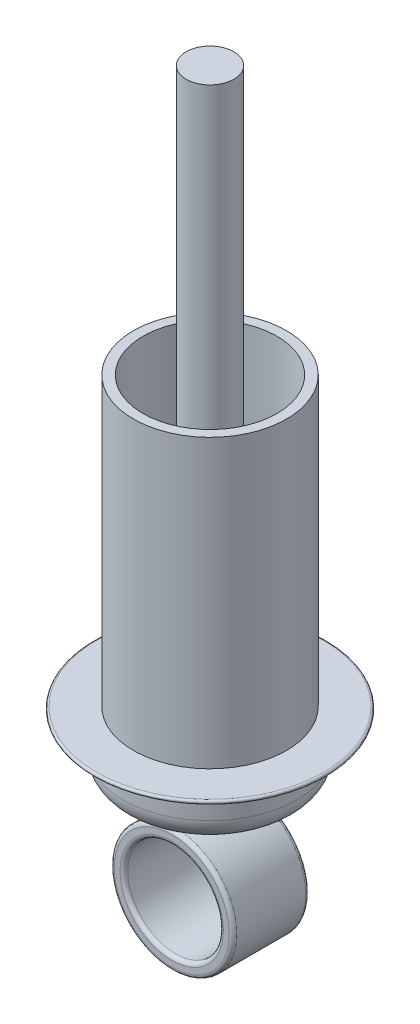
ISO-10303-21;
HEADER;
FILE_DESCRIPTION(('STEP AP214'),'2;1');
FILE_NAME('part.step','',(''),(''),'','','');
FILE_SCHEMA(('AUTOMOTIVE_DESIGN { 1 0 10303 214 1 1 1 1 }'));
ENDSEC;
DATA;
#1=APPLICATION_CONTEXT('core data for automotive mechanical design processes');
#2=APPLICATION_PROTOCOL_DEFINITION('international standard','automotive_design',2000,#1);
#3=PRODUCT_CONTEXT('',#1,'mechanical');
#4=PRODUCT('Part','Part','',(#3));
#5=PRODUCT_RELATED_PRODUCT_CATEGORY('part','',(#4));
#6=PRODUCT_DEFINITION_FORMATION('','',#4);
#7=PRODUCT_DEFINITION_CONTEXT('part definition',#1,'design');
#8=PRODUCT_DEFINITION('design','',#6,#7);
#9=PRODUCT_DEFINITION_SHAPE('','',#8);
#10=(LENGTH_UNIT() NAMED_UNIT(*) SI_UNIT(.MILLI.,.METRE.));
#11=(NAMED_UNIT(*) PLANE_ANGLE_UNIT() SI_UNIT($,.RADIAN.));
#12=(NAMED_UNIT(*) SI_UNIT($,.STERADIAN.) SOLID_ANGLE_UNIT());
#13=UNCERTAINTY_MEASURE_WITH_UNIT(LENGTH_MEASURE(1.E-05),#10,'distance_accuracy_value','');
#14=(GEOMETRIC_REPRESENTATION_CONTEXT(3) GLOBAL_UNCERTAINTY_ASSIGNED_CONTEXT((#13)) GLOBAL_UNIT_ASSIGNED_CONTEXT((#10,
#11,#12)) REPRESENTATION_CONTEXT('',''));
#15=CARTESIAN_POINT('',(0.,0.,0.));
#16=DIRECTION('',(0.,0.,1.));
#17=DIRECTION('',(1.,0.,0.));
#18=AXIS2_PLACEMENT_3D('',#15,#16,#17);
#19=CARTESIAN_POINT('',(0.,33.58905173027,0.));
#20=DIRECTION('',(0.,1.,0.));
#21=DIRECTION('',(0.,0.,-1.));
#22=AXIS2_PLACEMENT_3D('',#19,#20,#21);
#23=CYLINDRICAL_SURFACE('',#22,22.7249978923122);
#24=CARTESIAN_POINT('',(0.,38.,0.));
#25=DIRECTION('',(0.,1.,0.));
#26=DIRECTION('',(1.,0.,0.));
#27=AXIS2_PLACEMENT_3D('',#24,#25,#26);
#28=CIRCLE('',#27,22.7249978923122);
#29=CARTESIAN_POINT('',(0.,38.,22.7249978923122));
#30=VERTEX_POINT('',#29);
#31=EDGE_CURVE('P0_E199',#30,#30,#28,.T.);
#32=ORIENTED_EDGE('',*,*,#31,.F.);
#33=DIRECTION('',(0.,-1.,0.));
#34=VECTOR('',#33,1.);
#35=CARTESIAN_POINT('',(0.,33.58905173027,22.7249978923122));
#36=LINE('',#35,#34);
#37=CARTESIAN_POINT('',(0.,29.1781034605399,22.7249978923122));
#38=VERTEX_POINT('',#37);
#39=EDGE_CURVE('P0_E11',#30,#38,#36,.T.);
#40=ORIENTED_EDGE('',*,*,#39,.T.);
#41=CARTESIAN_POINT('',(0.,29.1781034605399,0.));
#42=DIRECTION('',(0.,1.,0.));
#43=DIRECTION('',(1.,0.,0.));
#44=AXIS2_PLACEMENT_3D('',#41,#42,#43);
#45=CIRCLE('',#44,22.7249978923122);
#46=CARTESIAN_POINT('',(0.,29.1781034605399,-22.7249978923122));
#47=VERTEX_POINT('',#46);
#48=EDGE_CURVE('P0_E122',#38,#47,#45,.T.);
#49=ORIENTED_EDGE('',*,*,#48,.T.);
#50=CARTESIAN_POINT('',(0.,29.1781034605399,0.));
#51=DIRECTION('',(0.,1.,0.));
#52=DIRECTION('',(1.,0.,0.));
#53=AXIS2_PLACEMENT_3D('',#50,#51,#52);
#54=CIRCLE('',#53,22.7249978923122);
#55=EDGE_CURVE('P0_E152',#47,#38,#54,.T.);
#56=ORIENTED_EDGE('',*,*,#55,.T.);
#57=ORIENTED_EDGE('',*,*,#39,.F.);
#58=EDGE_LOOP('',(#32,#40,#49,#56,#57));
#59=FACE_BOUND('',#58,.T.);
#60=ADVANCED_FACE('P0_F17',(#59),#23,.T.);
#61=CARTESIAN_POINT('',(0.,29.1781034605399,0.));
#62=DIRECTION('',(0.,1.,0.));
#63=DIRECTION('',(0.,0.,1.));
#64=AXIS2_PLACEMENT_3D('',#61,#62,#63);
#65=TOROIDAL_SURFACE('',#64,16.7249978923122,6.);
#66=ORIENTED_EDGE('',*,*,#48,.F.);
#67=ORIENTED_EDGE('',*,*,#55,.F.);
#68=CARTESIAN_POINT('',(0.,29.1781034605399,-16.7249978923122));
#69=DIRECTION('',(-1.,0.,0.));
#70=DIRECTION('',(0.,0.,-1.));
#71=AXIS2_PLACEMENT_3D('',#68,#69,#70);
#72=CIRCLE('',#71,6.);
#73=CARTESIAN_POINT('',(0.,24.2145079385144,-20.0958612081006));
#74=VERTEX_POINT('',#73);
#75=EDGE_CURVE('P0_E27',#47,#74,#72,.T.);
#76=ORIENTED_EDGE('',*,*,#75,.T.);
#77=CARTESIAN_POINT('',(0.,24.2145079385144,0.));
#78=DIRECTION('',(0.,1.,0.));
#79=DIRECTION('',(1.,0.,0.));
#80=AXIS2_PLACEMENT_3D('',#77,#78,#79);
#81=CIRCLE('',#80,20.0958612081006);
#82=CARTESIAN_POINT('',(0.,24.2145079385144,20.0958612081006));
#83=VERTEX_POINT('',#82);
#84=EDGE_CURVE('P0_E163',#74,#83,#81,.T.);
#85=ORIENTED_EDGE('',*,*,#84,.T.);
#86=CARTESIAN_POINT('',(0.,24.2145079385144,0.));
#87=DIRECTION('',(0.,1.,0.));
#88=DIRECTION('',(1.,0.,0.));
#89=AXIS2_PLACEMENT_3D('',#86,#87,#88);
#90=CIRCLE('',#89,20.0958612081006);
#91=EDGE_CURVE('P0_E120',#83,#74,#90,.T.);
#92=ORIENTED_EDGE('',*,*,#91,.T.);
#93=ORIENTED_EDGE('',*,*,#75,.F.);
#94=EDGE_LOOP('',(#66,#67,#76,#85,#92,#93));
#95=FACE_BOUND('',#94,.T.);
#96=ADVANCED_FACE('P0_F229',(#95),#65,.T.);
#97=CARTESIAN_POINT('',(0.,20.2799880489196,0.));
#98=DIRECTION('',(0.,1.,0.));
#99=DIRECTION('',(0.,0.,-1.));
#100=AXIS2_PLACEMENT_3D('',#97,#98,#99);
#101=CONICAL_SURFACE('',#100,14.3022814999462,0.974223551000245);
#102=ORIENTED_EDGE('',*,*,#84,.F.);
#103=ORIENTED_EDGE('',*,*,#91,.F.);
#104=DIRECTION('',(0.,-0.56181055263139,-0.827265920337597));
#105=VECTOR('',#104,1.);
#106=CARTESIAN_POINT('',(0.,20.2799880489196,14.3022814999462));
#107=LINE('',#106,#105);
#108=CARTESIAN_POINT('',(0.,16.3454681593248,8.50870179179187));
#109=VERTEX_POINT('',#108);
#110=EDGE_CURVE('P0_E61',#83,#109,#107,.T.);
#111=ORIENTED_EDGE('',*,*,#110,.T.);
#112=CARTESIAN_POINT('',(0.,16.3454681593248,0.));
#113=DIRECTION('',(0.,1.,0.));
#114=DIRECTION('',(1.,0.,0.));
#115=AXIS2_PLACEMENT_3D('',#112,#113,#114);
#116=CIRCLE('',#115,8.50870179179188);
#117=CARTESIAN_POINT('',(0.,16.3454681593248,-8.50870179179188));
#118=VERTEX_POINT('',#117);
#119=EDGE_CURVE('P0_E119',#109,#118,#116,.T.);
#120=ORIENTED_EDGE('',*,*,#119,.T.);
#121=CARTESIAN_POINT('',(0.,16.3454681593248,0.));
#122=DIRECTION('',(0.,1.,0.));
#123=DIRECTION('',(1.,0.,0.));
#124=AXIS2_PLACEMENT_3D('',#121,#122,#123);
#125=CIRCLE('',#124,8.50870179179188);
#126=EDGE_CURVE('P0_E125',#118,#109,#125,.T.);
#127=ORIENTED_EDGE('',*,*,#126,.T.);
#128=ORIENTED_EDGE('',*,*,#110,.F.);
#129=EDGE_LOOP('',(#102,#103,#111,#120,#127,#128));
#130=FACE_BOUND('',#129,.T.);
#131=ADVANCED_FACE('P0_F117',(#130),#101,.T.);
#132=CARTESIAN_POINT('',(0.,18.,0.));
#133=DIRECTION('',(0.,1.,0.));
#134=DIRECTION('',(0.,0.,1.));
#135=AXIS2_PLACEMENT_3D('',#132,#133,#134);
#136=TOROIDAL_SURFACE('',#135,7.3850806865291,2.);
#137=ORIENTED_EDGE('',*,*,#119,.F.);
#138=ORIENTED_EDGE('',*,*,#126,.F.);
#139=CARTESIAN_POINT('',(0.,18.,-7.3850806865291));
#140=DIRECTION('',(-1.,0.,0.));
#141=DIRECTION('',(0.,0.,-1.));
#142=AXIS2_PLACEMENT_3D('',#139,#140,#141);
#143=CIRCLE('',#142,2.);
#144=CARTESIAN_POINT('',(0.,16.,-7.38508068652909));
#145=VERTEX_POINT('',#144);
#146=EDGE_CURVE('P0_E128',#118,#145,#143,.T.);
#147=ORIENTED_EDGE('',*,*,#146,.T.);
#148=CARTESIAN_POINT('',(0.,16.,0.));
#149=DIRECTION('',(0.,1.,0.));
#150=DIRECTION('',(1.,0.,0.));
#151=AXIS2_PLACEMENT_3D('',#148,#149,#150);
#152=CIRCLE('',#151,7.38508068652909);
#153=CARTESIAN_POINT('',(0.,16.,7.38508068652909));
#154=VERTEX_POINT('',#153);
#155=EDGE_CURVE('P0_E133',#145,#154,#152,.T.);
#156=ORIENTED_EDGE('',*,*,#155,.T.);
#157=CARTESIAN_POINT('',(0.,16.,0.));
#158=DIRECTION('',(0.,1.,0.));
#159=DIRECTION('',(1.,0.,0.));
#160=AXIS2_PLACEMENT_3D('',#157,#158,#159);
#161=CIRCLE('',#160,7.38508068652909);
#162=EDGE_CURVE('P0_E145',#154,#145,#161,.T.);
#163=ORIENTED_EDGE('',*,*,#162,.T.);
#164=ORIENTED_EDGE('',*,*,#146,.F.);
#165=EDGE_LOOP('',(#137,#138,#147,#156,#163,#164));
#166=FACE_BOUND('',#165,.T.);
#167=ADVANCED_FACE('P0_F130',(#166),#136,.T.);
#168=CARTESIAN_POINT('',(0.,16.,-7.38508068652909));
#169=DIRECTION('',(0.,-1.,0.));
#170=DIRECTION('',(0.,0.,-1.));
#171=AXIS2_PLACEMENT_3D('',#168,#169,#170);
#172=PLANE('',#171);
#173=DIRECTION('',(0.,0.,1.));
#174=VECTOR('',#173,1.);
#175=CARTESIAN_POINT('',(0.,16.,0.));
#176=LINE('',#175,#174);
#177=EDGE_CURVE('P0_E147',#145,#154,#176,.T.);
#178=ORIENTED_EDGE('',*,*,#177,.T.);
#179=ORIENTED_EDGE('',*,*,#155,.F.);
#180=EDGE_LOOP('',(#178,#179));
#181=FACE_BOUND('',#180,.T.);
#182=ADVANCED_FACE('P0_F293',(#181),#172,.T.);
#183=CARTESIAN_POINT('',(0.,184.,0.));
#184=DIRECTION('',(0.,1.,0.));
#185=DIRECTION('',(1.,0.,0.));
#186=AXIS2_PLACEMENT_3D('',#183,#184,#185);
#187=PLANE('',#186);
#188=CARTESIAN_POINT('',(0.,184.,0.));
#189=DIRECTION('',(0.,1.,0.));
#190=DIRECTION('',(1.,0.,0.));
#191=AXIS2_PLACEMENT_3D('',#188,#189,#190);
#192=CIRCLE('',#191,6.23);
#193=CARTESIAN_POINT('',(0.,184.,6.23));
#194=VERTEX_POINT('',#193);
#195=EDGE_CURVE('P0_E172',#194,#194,#192,.T.);
#196=ORIENTED_EDGE('',*,*,#195,.T.);
#197=EDGE_LOOP('',(#196));
#198=FACE_BOUND('',#197,.T.);
#199=ADVANCED_FACE('P0_F297',(#198),#187,.T.);
#200=CARTESIAN_POINT('',(0.,111.5,0.));
#201=DIRECTION('',(0.,1.,0.));
#202=DIRECTION('',(0.,0.,-1.));
#203=AXIS2_PLACEMENT_3D('',#200,#201,#202);
#204=CYLINDRICAL_SURFACE('',#203,6.23);
#205=ORIENTED_EDGE('',*,*,#195,.F.);
#206=DIRECTION('',(0.,-1.,0.));
#207=VECTOR('',#206,1.);
#208=CARTESIAN_POINT('',(0.,111.5,6.23));
#209=LINE('',#208,#207);
#210=CARTESIAN_POINT('',(0.,39.,6.23));
#211=VERTEX_POINT('',#210);
#212=EDGE_CURVE('P0_E140',#194,#211,#209,.T.);
#213=ORIENTED_EDGE('',*,*,#212,.T.);
#214=CARTESIAN_POINT('',(0.,39.,0.));
#215=DIRECTION('',(0.,1.,0.));
#216=DIRECTION('',(1.,0.,0.));
#217=AXIS2_PLACEMENT_3D('',#214,#215,#216);
#218=CIRCLE('',#217,6.23);
#219=EDGE_CURVE('P0_E193',#211,#211,#218,.T.);
#220=ORIENTED_EDGE('',*,*,#219,.T.);
#221=ORIENTED_EDGE('',*,*,#212,.F.);
#222=EDGE_LOOP('',(#205,#213,#220,#221));
#223=FACE_BOUND('',#222,.T.);
#224=ADVANCED_FACE('P0_F330',(#223),#204,.T.);
#225=CARTESIAN_POINT('',(0.,39.,-6.23));
#226=DIRECTION('',(0.,1.,0.));
#227=DIRECTION('',(1.,0.,0.));
#228=AXIS2_PLACEMENT_3D('',#225,#226,#227);
#229=PLANE('',#228);
#230=ORIENTED_EDGE('',*,*,#219,.F.);
#231=EDGE_LOOP('',(#230));
#232=FACE_BOUND('',#231,.T.);
#233=CARTESIAN_POINT('',(0.,39.,0.));
#234=DIRECTION('',(0.,1.,0.));
#235=DIRECTION('',(-1.,0.,0.));
#236=AXIS2_PLACEMENT_3D('',#233,#234,#235);
#237=CIRCLE('',#236,17.5);
#238=CARTESIAN_POINT('',(17.5,39.,0.));
#239=VERTEX_POINT('',#238);
#240=EDGE_CURVE('P0_E173',#239,#239,#237,.T.);
#241=ORIENTED_EDGE('',*,*,#240,.T.);
#242=EDGE_LOOP('',(#241));
#243=FACE_BOUND('',#242,.T.);
#244=ADVANCED_FACE('P0_F307',(#232,#243),#229,.T.);
#245=CARTESIAN_POINT('',(0.,38.5,0.));
#246=DIRECTION('',(0.,1.,0.));
#247=DIRECTION('',(0.,0.,1.));
#248=AXIS2_PLACEMENT_3D('',#245,#246,#247);
#249=TOROIDAL_SURFACE('',#248,29.75,0.5);
#250=CARTESIAN_POINT('',(0.,39.,0.));
#251=DIRECTION('',(0.,1.,0.));
#252=DIRECTION('',(1.,0.,0.));
#253=AXIS2_PLACEMENT_3D('',#250,#251,#252);
#254=CIRCLE('',#253,29.75);
#255=CARTESIAN_POINT('',(0.,39.,-29.75));
#256=VERTEX_POINT('',#255);
#257=EDGE_CURVE('P0_E159',#256,#256,#254,.T.);
#258=ORIENTED_EDGE('',*,*,#257,.F.);
#259=CARTESIAN_POINT('',(0.,38.5,-29.75));
#260=DIRECTION('',(-1.,0.,0.));
#261=DIRECTION('',(0.,0.,-1.));
#262=AXIS2_PLACEMENT_3D('',#259,#260,#261);
#263=CIRCLE('',#262,0.5);
#264=CARTESIAN_POINT('',(0.,38.,-29.75));
#265=VERTEX_POINT('',#264);
#266=EDGE_CURVE('P0_E84',#256,#265,#263,.T.);
#267=ORIENTED_EDGE('',*,*,#266,.T.);
#268=CARTESIAN_POINT('',(0.,38.,0.));
#269=DIRECTION('',(0.,1.,0.));
#270=DIRECTION('',(1.,0.,0.));
#271=AXIS2_PLACEMENT_3D('',#268,#269,#270);
#272=CIRCLE('',#271,29.75);
#273=EDGE_CURVE('P0_E143',#265,#265,#272,.T.);
#274=ORIENTED_EDGE('',*,*,#273,.T.);
#275=ORIENTED_EDGE('',*,*,#266,.F.);
#276=EDGE_LOOP('',(#258,#267,#274,#275));
#277=FACE_BOUND('',#276,.T.);
#278=ADVANCED_FACE('P0_F206',(#277),#249,.T.);
#279=CARTESIAN_POINT('',(0.,38.,-29.75));
#280=DIRECTION('',(0.,-1.,0.));
#281=DIRECTION('',(0.,0.,-1.));
#282=AXIS2_PLACEMENT_3D('',#279,#280,#281);
#283=PLANE('',#282);
#284=ORIENTED_EDGE('',*,*,#31,.T.);
#285=EDGE_LOOP('',(#284));
#286=FACE_BOUND('',#285,.T.);
#287=ORIENTED_EDGE('',*,*,#273,.F.);
#288=EDGE_LOOP('',(#287));
#289=FACE_BOUND('',#288,.T.);
#290=ADVANCED_FACE('P0_F224',(#286,#289),#283,.T.);
#291=CARTESIAN_POINT('',(0.,16.,-7.38508068652909));
#292=DIRECTION('',(0.,-1.,0.));
#293=DIRECTION('',(0.,0.,-1.));
#294=AXIS2_PLACEMENT_3D('',#291,#292,#293);
#295=PLANE('',#294);
#296=ORIENTED_EDGE('',*,*,#177,.F.);
#297=ORIENTED_EDGE('',*,*,#162,.F.);
#298=EDGE_LOOP('',(#296,#297));
#299=FACE_BOUND('',#298,.T.);
#300=ADVANCED_FACE('P0_F212',(#299),#295,.T.);
#301=CARTESIAN_POINT('',(0.,39.,-6.23));
#302=DIRECTION('',(0.,1.,0.));
#303=DIRECTION('',(1.,0.,0.));
#304=AXIS2_PLACEMENT_3D('',#301,#302,#303);
#305=PLANE('',#304);
#306=CARTESIAN_POINT('',(0.,39.,0.));
#307=DIRECTION('',(0.,-1.,0.));
#308=DIRECTION('',(1.,0.,0.));
#309=AXIS2_PLACEMENT_3D('',#306,#307,#308);
#310=CIRCLE('',#309,20.);
#311=CARTESIAN_POINT('',(-20.,39.,0.));
#312=VERTEX_POINT('',#311);
#313=EDGE_CURVE('P0_E97',#312,#312,#310,.T.);
#314=ORIENTED_EDGE('',*,*,#313,.T.);
#315=EDGE_LOOP('',(#314));
#316=FACE_BOUND('',#315,.T.);
#317=ORIENTED_EDGE('',*,*,#257,.T.);
#318=EDGE_LOOP('',(#317));
#319=FACE_BOUND('',#318,.T.);
#320=ADVANCED_FACE('P0_F209',(#316,#319),#305,.T.);
#321=CARTESIAN_POINT('',(0.,114.,0.));
#322=DIRECTION('',(0.,1.,0.));
#323=DIRECTION('',(1.,0.,0.));
#324=AXIS2_PLACEMENT_3D('',#321,#322,#323);
#325=PLANE('',#324);
#326=CARTESIAN_POINT('',(0.,114.,0.));
#327=DIRECTION('',(0.,-1.,0.));
#328=DIRECTION('',(-1.,0.,0.));
#329=AXIS2_PLACEMENT_3D('',#326,#327,#328);
#330=CIRCLE('',#329,17.5);
#331=CARTESIAN_POINT('',(17.5,114.,0.));
#332=VERTEX_POINT('',#331);
#333=EDGE_CURVE('P0_E153',#332,#332,#330,.T.);
#334=ORIENTED_EDGE('',*,*,#333,.T.);
#335=EDGE_LOOP('',(#334));
#336=FACE_BOUND('',#335,.T.);
#337=CARTESIAN_POINT('',(0.,114.,0.));
#338=DIRECTION('',(0.,1.,0.));
#339=DIRECTION('',(1.,0.,0.));
#340=AXIS2_PLACEMENT_3D('',#337,#338,#339);
#341=CIRCLE('',#340,20.);
#342=CARTESIAN_POINT('',(-20.,114.,0.));
#343=VERTEX_POINT('',#342);
#344=EDGE_CURVE('P0_E156',#343,#343,#341,.T.);
#345=ORIENTED_EDGE('',*,*,#344,.T.);
#346=EDGE_LOOP('',(#345));
#347=FACE_BOUND('',#346,.T.);
#348=ADVANCED_FACE('P0_F211',(#336,#347),#325,.T.);
#349=CARTESIAN_POINT('',(0.,39.,0.));
#350=DIRECTION('',(0.,1.,0.));
#351=DIRECTION('',(1.,0.,0.));
#352=AXIS2_PLACEMENT_3D('',#349,#350,#351);
#353=CYLINDRICAL_SURFACE('',#352,20.);
#354=ORIENTED_EDGE('',*,*,#344,.F.);
#355=DIRECTION('',(0.,-1.,0.));
#356=VECTOR('',#355,1.);
#357=CARTESIAN_POINT('',(-20.,39.,0.));
#358=LINE('',#357,#356);
#359=EDGE_CURVE('P0_E167',#343,#312,#358,.T.);
#360=ORIENTED_EDGE('',*,*,#359,.T.);
#361=ORIENTED_EDGE('',*,*,#313,.F.);
#362=ORIENTED_EDGE('',*,*,#359,.F.);
#363=EDGE_LOOP('',(#354,#360,#361,#362));
#364=FACE_BOUND('',#363,.T.);
#365=ADVANCED_FACE('P0_F221',(#364),#353,.T.);
#366=CARTESIAN_POINT('',(0.,39.,0.));
#367=DIRECTION('',(0.,1.,0.));
#368=DIRECTION('',(-1.,0.,0.));
#369=AXIS2_PLACEMENT_3D('',#366,#367,#368);
#370=CYLINDRICAL_SURFACE('',#369,17.5);
#371=ORIENTED_EDGE('',*,*,#240,.F.);
#372=DIRECTION('',(0.,1.,0.));
#373=VECTOR('',#372,1.);
#374=CARTESIAN_POINT('',(17.5,39.,0.));
#375=LINE('',#374,#373);
#376=EDGE_CURVE('P0_E20',#239,#332,#375,.T.);
#377=ORIENTED_EDGE('',*,*,#376,.T.);
#378=ORIENTED_EDGE('',*,*,#333,.F.);
#379=ORIENTED_EDGE('',*,*,#376,.F.);
#380=EDGE_LOOP('',(#371,#377,#378,#379));
#381=FACE_BOUND('',#380,.T.);
#382=ADVANCED_FACE('P0_F316',(#381),#370,.F.);
#383=CLOSED_SHELL('',(#60,#96,#131,#167,#182,#199,#224,#244,#278,#290,#300,#320,#348,#365,#382));
#384=MANIFOLD_SOLID_BREP('P0_B1',#383);
#385=CARTESIAN_POINT('',(0.,0.,-9.));
#386=DIRECTION('',(0.,0.,-1.));
#387=DIRECTION('',(-1.,0.,0.));
#388=AXIS2_PLACEMENT_3D('',#385,#386,#387);
#389=TOROIDAL_SURFACE('',#388,15.,1.);
#390=CARTESIAN_POINT('',(0.,0.,-10.));
#391=DIRECTION('',(0.,0.,1.));
#392=DIRECTION('',(-1.,0.,0.));
#393=AXIS2_PLACEMENT_3D('',#390,#391,#392);
#394=CIRCLE('',#393,15.);
#395=CARTESIAN_POINT('',(15.,0.,-10.));
#396=VERTEX_POINT('',#395);
#397=EDGE_CURVE('P1_E27',#396,#396,#394,.T.);
#398=ORIENTED_EDGE('',*,*,#397,.T.);
#399=CARTESIAN_POINT('',(15.,0.,-9.));
#400=DIRECTION('',(0.,-1.,0.));
#401=DIRECTION('',(1.,0.,0.));
#402=AXIS2_PLACEMENT_3D('',#399,#400,#401);
#403=CIRCLE('',#402,1.);
#404=CARTESIAN_POINT('',(16.,0.,-9.));
#405=VERTEX_POINT('',#404);
#406=EDGE_CURVE('P1_E10',#396,#405,#403,.T.);
#407=ORIENTED_EDGE('',*,*,#406,.T.);
#408=CARTESIAN_POINT('',(0.,0.,-9.));
#409=DIRECTION('',(0.,0.,-1.));
#410=DIRECTION('',(-1.,0.,0.));
#411=AXIS2_PLACEMENT_3D('',#408,#409,#410);
#412=CIRCLE('',#411,16.);
#413=CARTESIAN_POINT('',(0.,16.,-9.));
#414=VERTEX_POINT('',#413);
#415=EDGE_CURVE('P1_E120',#405,#414,#412,.T.);
#416=ORIENTED_EDGE('',*,*,#415,.T.);
#417=CARTESIAN_POINT('',(0.,0.,-9.));
#418=DIRECTION('',(0.,0.,-1.));
#419=DIRECTION('',(-1.,0.,0.));
#420=AXIS2_PLACEMENT_3D('',#417,#418,#419);
#421=CIRCLE('',#420,16.);
#422=EDGE_CURVE('P1_E67',#414,#405,#421,.T.);
#423=ORIENTED_EDGE('',*,*,#422,.T.);
#424=ORIENTED_EDGE('',*,*,#406,.F.);
#425=EDGE_LOOP('',(#398,#407,#416,#423,#424));
#426=FACE_BOUND('',#425,.T.);
#427=ADVANCED_FACE('P1_F16',(#426),#389,.T.);
#428=CARTESIAN_POINT('',(0.,0.,-10.));
#429=DIRECTION('',(0.,0.,1.));
#430=DIRECTION('',(1.,0.,0.));
#431=AXIS2_PLACEMENT_3D('',#428,#429,#430);
#432=PLANE('',#431);
#433=CARTESIAN_POINT('',(0.,0.,-10.));
#434=DIRECTION('',(0.,0.,-1.));
#435=DIRECTION('',(-1.,0.,0.));
#436=AXIS2_PLACEMENT_3D('',#433,#434,#435);
#437=CIRCLE('',#436,13.5);
#438=CARTESIAN_POINT('',(-13.5,0.,-10.));
#439=VERTEX_POINT('',#438);
#440=EDGE_CURVE('P1_E101',#439,#439,#437,.T.);
#441=ORIENTED_EDGE('',*,*,#440,.F.);
#442=EDGE_LOOP('',(#441));
#443=FACE_BOUND('',#442,.T.);
#444=ORIENTED_EDGE('',*,*,#397,.F.);
#445=EDGE_LOOP('',(#444));
#446=FACE_BOUND('',#445,.T.);
#447=ADVANCED_FACE('P1_F150',(#443,#446),#432,.F.);
#448=CARTESIAN_POINT('',(0.,0.,9.));
#449=DIRECTION('',(0.,0.,1.));
#450=DIRECTION('',(1.,0.,0.));
#451=AXIS2_PLACEMENT_3D('',#448,#449,#450);
#452=TOROIDAL_SURFACE('',#451,15.,1.);
#453=CARTESIAN_POINT('',(0.,0.,10.));
#454=DIRECTION('',(0.,0.,-1.));
#455=DIRECTION('',(-1.,0.,0.));
#456=AXIS2_PLACEMENT_3D('',#453,#454,#455);
#457=CIRCLE('',#456,15.);
#458=CARTESIAN_POINT('',(-15.,0.,10.));
#459=VERTEX_POINT('',#458);
#460=EDGE_CURVE('P1_E143',#459,#459,#457,.T.);
#461=ORIENTED_EDGE('',*,*,#460,.T.);
#462=CARTESIAN_POINT('',(-15.,0.,9.));
#463=DIRECTION('',(0.,-1.,0.));
#464=DIRECTION('',(-1.,0.,0.));
#465=AXIS2_PLACEMENT_3D('',#462,#463,#464);
#466=CIRCLE('',#465,1.);
#467=CARTESIAN_POINT('',(-16.,0.,9.));
#468=VERTEX_POINT('',#467);
#469=EDGE_CURVE('P1_E20',#459,#468,#466,.T.);
#470=ORIENTED_EDGE('',*,*,#469,.T.);
#471=CARTESIAN_POINT('',(0.,0.,9.));
#472=DIRECTION('',(0.,0.,1.));
#473=DIRECTION('',(-1.,0.,0.));
#474=AXIS2_PLACEMENT_3D('',#471,#472,#473);
#475=CIRCLE('',#474,16.);
#476=CARTESIAN_POINT('',(0.,16.,9.));
#477=VERTEX_POINT('',#476);
#478=EDGE_CURVE('P1_E137',#468,#477,#475,.T.);
#479=ORIENTED_EDGE('',*,*,#478,.T.);
#480=CARTESIAN_POINT('',(0.,0.,9.));
#481=DIRECTION('',(0.,0.,1.));
#482=DIRECTION('',(-1.,0.,0.));
#483=AXIS2_PLACEMENT_3D('',#480,#481,#482);
#484=CIRCLE('',#483,16.);
#485=EDGE_CURVE('P1_E130',#477,#468,#484,.T.);
#486=ORIENTED_EDGE('',*,*,#485,.T.);
#487=ORIENTED_EDGE('',*,*,#469,.F.);
#488=EDGE_LOOP('',(#461,#470,#479,#486,#487));
#489=FACE_BOUND('',#488,.T.);
#490=ADVANCED_FACE('P1_F18',(#489),#452,.T.);
#491=CARTESIAN_POINT('',(0.,0.,10.));
#492=DIRECTION('',(0.,0.,1.));
#493=DIRECTION('',(1.,0.,0.));
#494=AXIS2_PLACEMENT_3D('',#491,#492,#493);
#495=PLANE('',#494);
#496=CARTESIAN_POINT('',(0.,0.,10.));
#497=DIRECTION('',(0.,0.,1.));
#498=DIRECTION('',(-1.,0.,0.));
#499=AXIS2_PLACEMENT_3D('',#496,#497,#498);
#500=CIRCLE('',#499,13.5);
#501=CARTESIAN_POINT('',(13.5,0.,10.));
#502=VERTEX_POINT('',#501);
#503=EDGE_CURVE('P1_E116',#502,#502,#500,.T.);
#504=ORIENTED_EDGE('',*,*,#503,.F.);
#505=EDGE_LOOP('',(#504));
#506=FACE_BOUND('',#505,.T.);
#507=ORIENTED_EDGE('',*,*,#460,.F.);
#508=EDGE_LOOP('',(#507));
#509=FACE_BOUND('',#508,.T.);
#510=ADVANCED_FACE('P1_F164',(#506,#509),#495,.T.);
#511=CARTESIAN_POINT('',(0.,0.,-9.));
#512=DIRECTION('',(0.,0.,1.));
#513=DIRECTION('',(1.,0.,0.));
#514=AXIS2_PLACEMENT_3D('',#511,#512,#513);
#515=TOROIDAL_SURFACE('',#514,13.5,1.);
#516=ORIENTED_EDGE('',*,*,#440,.T.);
#517=CARTESIAN_POINT('',(-13.5,0.,-9.));
#518=DIRECTION('',(0.,-1.,0.));
#519=DIRECTION('',(-1.,0.,0.));
#520=AXIS2_PLACEMENT_3D('',#517,#518,#519);
#521=CIRCLE('',#520,1.);
#522=CARTESIAN_POINT('',(-12.5,0.,-9.));
#523=VERTEX_POINT('',#522);
#524=EDGE_CURVE('P1_E85',#439,#523,#521,.T.);
#525=ORIENTED_EDGE('',*,*,#524,.T.);
#526=CARTESIAN_POINT('',(0.,0.,-9.));
#527=DIRECTION('',(0.,0.,1.));
#528=DIRECTION('',(-1.,0.,0.));
#529=AXIS2_PLACEMENT_3D('',#526,#527,#528);
#530=CIRCLE('',#529,12.5);
#531=CARTESIAN_POINT('',(12.5,0.,-9.));
#532=VERTEX_POINT('',#531);
#533=EDGE_CURVE('P1_E108',#523,#532,#530,.T.);
#534=ORIENTED_EDGE('',*,*,#533,.T.);
#535=CARTESIAN_POINT('',(0.,0.,-9.));
#536=DIRECTION('',(0.,0.,1.));
#537=DIRECTION('',(-1.,0.,0.));
#538=AXIS2_PLACEMENT_3D('',#535,#536,#537);
#539=CIRCLE('',#538,12.5);
#540=EDGE_CURVE('P1_E99',#532,#523,#539,.T.);
#541=ORIENTED_EDGE('',*,*,#540,.T.);
#542=ORIENTED_EDGE('',*,*,#524,.F.);
#543=EDGE_LOOP('',(#516,#525,#534,#541,#542));
#544=FACE_BOUND('',#543,.T.);
#545=ADVANCED_FACE('P1_F148',(#544),#515,.T.);
#546=CARTESIAN_POINT('',(0.,0.,0.));
#547=DIRECTION('',(0.,0.,1.));
#548=DIRECTION('',(-1.,0.,0.));
#549=AXIS2_PLACEMENT_3D('',#546,#547,#548);
#550=CYLINDRICAL_SURFACE('',#549,12.5);
#551=ORIENTED_EDGE('',*,*,#533,.F.);
#552=ORIENTED_EDGE('',*,*,#540,.F.);
#553=DIRECTION('',(0.,0.,1.));
#554=VECTOR('',#553,1.);
#555=CARTESIAN_POINT('',(12.5,0.,0.));
#556=LINE('',#555,#554);
#557=CARTESIAN_POINT('',(12.5,0.,9.));
#558=VERTEX_POINT('',#557);
#559=EDGE_CURVE('P1_E93',#532,#558,#556,.T.);
#560=ORIENTED_EDGE('',*,*,#559,.T.);
#561=CARTESIAN_POINT('',(0.,0.,9.));
#562=DIRECTION('',(0.,0.,-1.));
#563=DIRECTION('',(-1.,0.,0.));
#564=AXIS2_PLACEMENT_3D('',#561,#562,#563);
#565=CIRCLE('',#564,12.5);
#566=EDGE_CURVE('P1_E97',#558,#558,#565,.T.);
#567=ORIENTED_EDGE('',*,*,#566,.F.);
#568=ORIENTED_EDGE('',*,*,#559,.F.);
#569=EDGE_LOOP('',(#551,#552,#560,#567,#568));
#570=FACE_BOUND('',#569,.T.);
#571=ADVANCED_FACE('P1_F96',(#570),#550,.F.);
#572=CARTESIAN_POINT('',(0.,0.,9.));
#573=DIRECTION('',(0.,0.,-1.));
#574=DIRECTION('',(-1.,0.,0.));
#575=AXIS2_PLACEMENT_3D('',#572,#573,#574);
#576=TOROIDAL_SURFACE('',#575,13.5,1.);
#577=ORIENTED_EDGE('',*,*,#503,.T.);
#578=CARTESIAN_POINT('',(13.5,0.,9.));
#579=DIRECTION('',(0.,-1.,0.));
#580=DIRECTION('',(1.,0.,0.));
#581=AXIS2_PLACEMENT_3D('',#578,#579,#580);
#582=CIRCLE('',#581,1.);
#583=EDGE_CURVE('P1_E106',#502,#558,#582,.T.);
#584=ORIENTED_EDGE('',*,*,#583,.T.);
#585=ORIENTED_EDGE('',*,*,#566,.T.);
#586=ORIENTED_EDGE('',*,*,#583,.F.);
#587=EDGE_LOOP('',(#577,#584,#585,#586));
#588=FACE_BOUND('',#587,.T.);
#589=ADVANCED_FACE('P1_F105',(#588),#576,.T.);
#590=CARTESIAN_POINT('',(0.,0.,0.));
#591=DIRECTION('',(0.,0.,1.));
#592=DIRECTION('',(0.,-1.,0.));
#593=AXIS2_PLACEMENT_3D('',#590,#591,#592);
#594=CYLINDRICAL_SURFACE('',#593,16.);
#595=ORIENTED_EDGE('',*,*,#478,.F.);
#596=ORIENTED_EDGE('',*,*,#485,.F.);
#597=DIRECTION('',(0.,0.,-1.));
#598=VECTOR('',#597,1.);
#599=CARTESIAN_POINT('',(0.,16.,0.));
#600=LINE('',#599,#598);
#601=EDGE_CURVE('P1_E76',#477,#414,#600,.T.);
#602=ORIENTED_EDGE('',*,*,#601,.T.);
#603=ORIENTED_EDGE('',*,*,#415,.F.);
#604=ORIENTED_EDGE('',*,*,#422,.F.);
#605=ORIENTED_EDGE('',*,*,#601,.F.);
#606=EDGE_LOOP('',(#595,#596,#602,#603,#604,#605));
#607=FACE_BOUND('',#606,.T.);
#608=ADVANCED_FACE('P1_F187',(#607),#594,.T.);
#609=CLOSED_SHELL('',(#427,#447,#490,#510,#545,#571,#589,#608));
#610=MANIFOLD_SOLID_BREP('P1_B1',#609);
#611=ADVANCED_BREP_SHAPE_REPRESENTATION('',(#18,#384,#610),#14);
#612=SHAPE_DEFINITION_REPRESENTATION(#9,#611);
ENDSEC;
END-ISO-10303-21;
